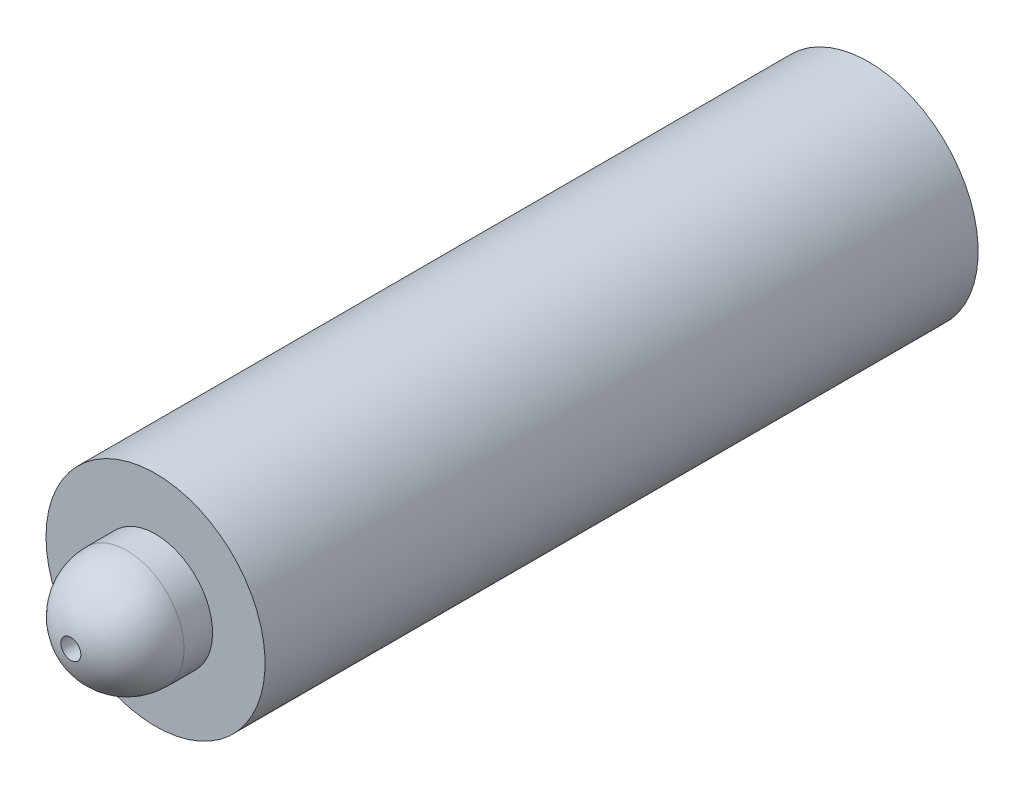
ISO-10303-21;
HEADER;
FILE_DESCRIPTION(('STEP AP214'),'2;1');
FILE_NAME('part.step','',(''),(''),'','','');
FILE_SCHEMA(('AUTOMOTIVE_DESIGN { 1 0 10303 214 1 1 1 1 }'));
ENDSEC;
DATA;
#1=APPLICATION_CONTEXT('core data for automotive mechanical design processes');
#2=APPLICATION_PROTOCOL_DEFINITION('international standard','automotive_design',2000,#1);
#3=PRODUCT_CONTEXT('',#1,'mechanical');
#4=PRODUCT('Part','Part','',(#3));
#5=PRODUCT_RELATED_PRODUCT_CATEGORY('part','',(#4));
#6=PRODUCT_DEFINITION_FORMATION('','',#4);
#7=PRODUCT_DEFINITION_CONTEXT('part definition',#1,'design');
#8=PRODUCT_DEFINITION('design','',#6,#7);
#9=PRODUCT_DEFINITION_SHAPE('','',#8);
#10=(LENGTH_UNIT() NAMED_UNIT(*) SI_UNIT(.MILLI.,.METRE.));
#11=(NAMED_UNIT(*) PLANE_ANGLE_UNIT() SI_UNIT($,.RADIAN.));
#12=(NAMED_UNIT(*) SI_UNIT($,.STERADIAN.) SOLID_ANGLE_UNIT());
#13=UNCERTAINTY_MEASURE_WITH_UNIT(LENGTH_MEASURE(1.E-05),#10,'distance_accuracy_value','');
#14=(GEOMETRIC_REPRESENTATION_CONTEXT(3) GLOBAL_UNCERTAINTY_ASSIGNED_CONTEXT((#13)) GLOBAL_UNIT_ASSIGNED_CONTEXT((#10,
#11,#12)) REPRESENTATION_CONTEXT('',''));
#15=CARTESIAN_POINT('',(0.,0.,0.));
#16=DIRECTION('',(0.,0.,1.));
#17=DIRECTION('',(1.,0.,0.));
#18=AXIS2_PLACEMENT_3D('',#15,#16,#17);
#19=CARTESIAN_POINT('',(0.,0.,79.375));
#20=DIRECTION('',(0.,0.,-1.));
#21=DIRECTION('',(-1.,0.,0.));
#22=AXIS2_PLACEMENT_3D('',#19,#20,#21);
#23=CYLINDRICAL_SURFACE('',#22,9.017);
#24=CARTESIAN_POINT('',(0.,0.,19.05));
#25=DIRECTION('',(0.,0.,-1.));
#26=DIRECTION('',(-1.,0.,0.));
#27=AXIS2_PLACEMENT_3D('',#24,#25,#26);
#28=CIRCLE('',#27,9.017);
#29=CARTESIAN_POINT('',(8.43952984472479,-3.17499999999994,19.05));
#30=VERTEX_POINT('',#29);
#31=CARTESIAN_POINT('',(8.43952984472475,3.17500000000005,19.05));
#32=VERTEX_POINT('',#31);
#33=EDGE_CURVE('E107',#30,#32,#28,.F.);
#34=ORIENTED_EDGE('',*,*,#33,.F.);
#35=DIRECTION('',(0.,0.,-1.));
#36=VECTOR('',#35,1.);
#37=CARTESIAN_POINT('',(8.43952984472479,-3.17499999999993,19.05));
#38=LINE('',#37,#36);
#39=CARTESIAN_POINT('',(8.43952984472479,-3.17499999999993,0.));
#40=VERTEX_POINT('',#39);
#41=EDGE_CURVE('E105',#30,#40,#38,.T.);
#42=ORIENTED_EDGE('',*,*,#41,.T.);
#43=CARTESIAN_POINT('',(0.,0.,0.));
#44=DIRECTION('',(0.,0.,1.));
#45=DIRECTION('',(1.,0.,0.));
#46=AXIS2_PLACEMENT_3D('',#43,#44,#45);
#47=CIRCLE('',#46,9.017);
#48=CARTESIAN_POINT('',(3.17500000000002,-8.43952984472476,0.));
#49=VERTEX_POINT('',#48);
#50=EDGE_CURVE('E118',#49,#40,#47,.T.);
#51=ORIENTED_EDGE('',*,*,#50,.F.);
#52=DIRECTION('',(0.,0.,-1.));
#53=VECTOR('',#52,1.);
#54=CARTESIAN_POINT('',(3.17500000000002,-8.43952984472476,19.05));
#55=LINE('',#54,#53);
#56=CARTESIAN_POINT('',(3.17500000000002,-8.43952984472476,19.05));
#57=VERTEX_POINT('',#56);
#58=EDGE_CURVE('E146',#57,#49,#55,.T.);
#59=ORIENTED_EDGE('',*,*,#58,.F.);
#60=CARTESIAN_POINT('',(0.,0.,19.05));
#61=DIRECTION('',(0.,0.,-1.));
#62=DIRECTION('',(-1.,0.,0.));
#63=AXIS2_PLACEMENT_3D('',#60,#61,#62);
#64=CIRCLE('',#63,9.017);
#65=CARTESIAN_POINT('',(-3.17499999999997,-8.43952984472478,19.05));
#66=VERTEX_POINT('',#65);
#67=EDGE_CURVE('E152',#66,#57,#64,.F.);
#68=ORIENTED_EDGE('',*,*,#67,.F.);
#69=DIRECTION('',(0.,0.,-1.));
#70=VECTOR('',#69,1.);
#71=CARTESIAN_POINT('',(-3.17499999999997,-8.43952984472478,19.05));
#72=LINE('',#71,#70);
#73=CARTESIAN_POINT('',(-3.17499999999997,-8.43952984472478,0.));
#74=VERTEX_POINT('',#73);
#75=EDGE_CURVE('E156',#66,#74,#72,.T.);
#76=ORIENTED_EDGE('',*,*,#75,.T.);
#77=CARTESIAN_POINT('',(-8.43952984472477,-3.17499999999999,0.));
#78=VERTEX_POINT('',#77);
#79=EDGE_CURVE('E121',#78,#74,#47,.T.);
#80=ORIENTED_EDGE('',*,*,#79,.F.);
#81=DIRECTION('',(0.,0.,-1.));
#82=VECTOR('',#81,1.);
#83=CARTESIAN_POINT('',(-8.43952984472477,-3.17499999999999,19.05));
#84=LINE('',#83,#82);
#85=CARTESIAN_POINT('',(-8.43952984472477,-3.17499999999999,19.05));
#86=VERTEX_POINT('',#85);
#87=EDGE_CURVE('E133',#86,#78,#84,.T.);
#88=ORIENTED_EDGE('',*,*,#87,.F.);
#89=CARTESIAN_POINT('',(0.,0.,19.05));
#90=DIRECTION('',(0.,0.,-1.));
#91=DIRECTION('',(-1.,0.,0.));
#92=AXIS2_PLACEMENT_3D('',#89,#90,#91);
#93=CIRCLE('',#92,9.017);
#94=CARTESIAN_POINT('',(-8.43952984472477,3.175,19.05));
#95=VERTEX_POINT('',#94);
#96=EDGE_CURVE('E139',#95,#86,#93,.F.);
#97=ORIENTED_EDGE('',*,*,#96,.F.);
#98=DIRECTION('',(0.,0.,-1.));
#99=VECTOR('',#98,1.);
#100=CARTESIAN_POINT('',(-8.43952984472477,3.17499999999999,19.05));
#101=LINE('',#100,#99);
#102=CARTESIAN_POINT('',(-8.43952984472477,3.17499999999999,0.));
#103=VERTEX_POINT('',#102);
#104=EDGE_CURVE('E143',#95,#103,#101,.T.);
#105=ORIENTED_EDGE('',*,*,#104,.T.);
#106=CARTESIAN_POINT('',(-3.17500000000008,8.43952984472473,0.));
#107=VERTEX_POINT('',#106);
#108=EDGE_CURVE('E162',#107,#103,#47,.T.);
#109=ORIENTED_EDGE('',*,*,#108,.F.);
#110=DIRECTION('',(0.,0.,-1.));
#111=VECTOR('',#110,1.);
#112=CARTESIAN_POINT('',(-3.17500000000008,8.43952984472473,19.05));
#113=LINE('',#112,#111);
#114=CARTESIAN_POINT('',(-3.17500000000008,8.43952984472473,19.05));
#115=VERTEX_POINT('',#114);
#116=EDGE_CURVE('E134',#115,#107,#113,.T.);
#117=ORIENTED_EDGE('',*,*,#116,.F.);
#118=CARTESIAN_POINT('',(0.,0.,19.05));
#119=DIRECTION('',(0.,0.,-1.));
#120=DIRECTION('',(-1.,0.,0.));
#121=AXIS2_PLACEMENT_3D('',#118,#119,#120);
#122=CIRCLE('',#121,9.017);
#123=CARTESIAN_POINT('',(3.17499999999991,8.4395298447248,19.05));
#124=VERTEX_POINT('',#123);
#125=EDGE_CURVE('E127',#124,#115,#122,.F.);
#126=ORIENTED_EDGE('',*,*,#125,.F.);
#127=DIRECTION('',(0.,0.,-1.));
#128=VECTOR('',#127,1.);
#129=CARTESIAN_POINT('',(3.1749999999999,8.4395298447248,19.05));
#130=LINE('',#129,#128);
#131=CARTESIAN_POINT('',(3.1749999999999,8.4395298447248,0.));
#132=VERTEX_POINT('',#131);
#133=EDGE_CURVE('E130',#124,#132,#130,.T.);
#134=ORIENTED_EDGE('',*,*,#133,.T.);
#135=CARTESIAN_POINT('',(8.43952984472475,3.17500000000005,0.));
#136=VERTEX_POINT('',#135);
#137=EDGE_CURVE('E117',#136,#132,#47,.T.);
#138=ORIENTED_EDGE('',*,*,#137,.F.);
#139=DIRECTION('',(0.,0.,-1.));
#140=VECTOR('',#139,1.);
#141=CARTESIAN_POINT('',(8.43952984472475,3.17500000000005,19.05));
#142=LINE('',#141,#140);
#143=EDGE_CURVE('E102',#32,#136,#142,.T.);
#144=ORIENTED_EDGE('',*,*,#143,.F.);
#145=EDGE_LOOP('',(#34,#42,#51,#59,#68,#76,#80,#88,#97,#105,#109,#117,#126,#134,#138,#144));
#146=FACE_BOUND('',#145,.T.);
#147=CARTESIAN_POINT('',(0.,0.,76.2));
#148=DIRECTION('',(0.,0.,1.));
#149=DIRECTION('',(1.,0.,0.));
#150=AXIS2_PLACEMENT_3D('',#147,#148,#149);
#151=CIRCLE('',#150,9.017);
#152=CARTESIAN_POINT('',(9.017,0.,76.2));
#153=VERTEX_POINT('',#152);
#154=EDGE_CURVE('E159',#153,#153,#151,.F.);
#155=ORIENTED_EDGE('',*,*,#154,.F.);
#156=EDGE_LOOP('',(#155));
#157=FACE_BOUND('',#156,.T.);
#158=ADVANCED_FACE('F35',(#146,#157),#23,.F.);
#159=CARTESIAN_POINT('',(0.,0.,0.));
#160=DIRECTION('',(0.,0.,1.));
#161=DIRECTION('',(1.,0.,0.));
#162=AXIS2_PLACEMENT_3D('',#159,#160,#161);
#163=PLANE('',#162);
#164=CARTESIAN_POINT('',(0.,0.,0.));
#165=DIRECTION('',(0.,0.,1.));
#166=DIRECTION('',(1.,0.,0.));
#167=AXIS2_PLACEMENT_3D('',#164,#165,#166);
#168=CIRCLE('',#167,12.192);
#169=CARTESIAN_POINT('',(-12.192,0.,0.));
#170=VERTEX_POINT('',#169);
#171=EDGE_CURVE('E44',#170,#170,#168,.T.);
#172=ORIENTED_EDGE('',*,*,#171,.F.);
#173=EDGE_LOOP('',(#172));
#174=FACE_BOUND('',#173,.T.);
#175=CARTESIAN_POINT('',(7.65040315173269,0.,0.));
#176=DIRECTION('',(0.,0.,-1.));
#177=DIRECTION('',(-1.,0.,0.));
#178=AXIS2_PLACEMENT_3D('',#175,#176,#177);
#179=CIRCLE('',#178,3.27159684826731);
#180=EDGE_CURVE('E108',#40,#136,#179,.F.);
#181=ORIENTED_EDGE('',*,*,#180,.T.);
#182=ORIENTED_EDGE('',*,*,#137,.T.);
#183=CARTESIAN_POINT('',(0.,7.65040315173269,0.));
#184=DIRECTION('',(0.,0.,-1.));
#185=DIRECTION('',(-1.,0.,0.));
#186=AXIS2_PLACEMENT_3D('',#183,#184,#185);
#187=CIRCLE('',#186,3.27159684826731);
#188=EDGE_CURVE('E128',#132,#107,#187,.F.);
#189=ORIENTED_EDGE('',*,*,#188,.T.);
#190=ORIENTED_EDGE('',*,*,#108,.T.);
#191=CARTESIAN_POINT('',(-7.65040315173269,0.,0.));
#192=DIRECTION('',(0.,0.,-1.));
#193=DIRECTION('',(-1.,0.,0.));
#194=AXIS2_PLACEMENT_3D('',#191,#192,#193);
#195=CIRCLE('',#194,3.27159684826731);
#196=EDGE_CURVE('E140',#103,#78,#195,.F.);
#197=ORIENTED_EDGE('',*,*,#196,.T.);
#198=ORIENTED_EDGE('',*,*,#79,.T.);
#199=CARTESIAN_POINT('',(0.,-7.65040315173269,0.));
#200=DIRECTION('',(0.,0.,-1.));
#201=DIRECTION('',(-1.,0.,0.));
#202=AXIS2_PLACEMENT_3D('',#199,#200,#201);
#203=CIRCLE('',#202,3.27159684826731);
#204=EDGE_CURVE('E153',#74,#49,#203,.F.);
#205=ORIENTED_EDGE('',*,*,#204,.T.);
#206=ORIENTED_EDGE('',*,*,#50,.T.);
#207=EDGE_LOOP('',(#181,#182,#189,#190,#197,#198,#205,#206));
#208=FACE_BOUND('',#207,.T.);
#209=ADVANCED_FACE('F167',(#174,#208),#163,.F.);
#210=CARTESIAN_POINT('',(0.,0.,79.375));
#211=DIRECTION('',(0.,0.,1.));
#212=DIRECTION('',(1.,0.,0.));
#213=AXIS2_PLACEMENT_3D('',#210,#211,#212);
#214=PLANE('',#213);
#215=CARTESIAN_POINT('',(0.,0.,79.375));
#216=DIRECTION('',(0.,0.,-1.));
#217=DIRECTION('',(0.,1.,0.));
#218=AXIS2_PLACEMENT_3D('',#215,#216,#217);
#219=CIRCLE('',#218,6.35);
#220=CARTESIAN_POINT('',(0.,6.35,79.375));
#221=VERTEX_POINT('',#220);
#222=EDGE_CURVE('E218',#221,#221,#219,.T.);
#223=ORIENTED_EDGE('',*,*,#222,.T.);
#224=EDGE_LOOP('',(#223));
#225=FACE_BOUND('',#224,.T.);
#226=CARTESIAN_POINT('',(0.,0.,79.375));
#227=DIRECTION('',(0.,0.,1.));
#228=DIRECTION('',(1.,0.,0.));
#229=AXIS2_PLACEMENT_3D('',#226,#227,#228);
#230=CIRCLE('',#229,12.192);
#231=CARTESIAN_POINT('',(-12.192,0.,79.375));
#232=VERTEX_POINT('',#231);
#233=EDGE_CURVE('E11',#232,#232,#230,.T.);
#234=ORIENTED_EDGE('',*,*,#233,.T.);
#235=EDGE_LOOP('',(#234));
#236=FACE_BOUND('',#235,.T.);
#237=ADVANCED_FACE('F170',(#225,#236),#214,.T.);
#238=CARTESIAN_POINT('',(0.,0.,79.375));
#239=DIRECTION('',(0.,0.,-1.));
#240=DIRECTION('',(-1.,0.,0.));
#241=AXIS2_PLACEMENT_3D('',#238,#239,#240);
#242=CYLINDRICAL_SURFACE('',#241,12.192);
#243=CARTESIAN_POINT('',(-12.192,0.,79.375));
#244=CARTESIAN_POINT('',(-12.192,0.,78.5481770833333));
#245=CARTESIAN_POINT('',(-12.192,0.,77.7213541666667));
#246=CARTESIAN_POINT('',(-12.192,0.,76.0677083333333));
#247=CARTESIAN_POINT('',(-12.192,0.,75.2408854166667));
#248=CARTESIAN_POINT('',(-12.192,0.,73.5872395833333));
#249=CARTESIAN_POINT('',(-12.192,0.,72.7604166666667));
#250=CARTESIAN_POINT('',(-12.192,0.,71.1067708333333));
#251=CARTESIAN_POINT('',(-12.192,0.,70.2799479166667));
#252=CARTESIAN_POINT('',(-12.192,0.,68.6263020833333));
#253=CARTESIAN_POINT('',(-12.192,0.,67.7994791666667));
#254=CARTESIAN_POINT('',(-12.192,0.,66.1458333333333));
#255=CARTESIAN_POINT('',(-12.192,0.,65.3190104166667));
#256=CARTESIAN_POINT('',(-12.192,0.,63.6653645833333));
#257=CARTESIAN_POINT('',(-12.192,0.,62.8385416666667));
#258=CARTESIAN_POINT('',(-12.192,0.,61.1848958333333));
#259=CARTESIAN_POINT('',(-12.192,0.,60.3580729166667));
#260=CARTESIAN_POINT('',(-12.192,0.,58.7044270833333));
#261=CARTESIAN_POINT('',(-12.192,0.,57.8776041666667));
#262=CARTESIAN_POINT('',(-12.192,0.,56.2239583333333));
#263=CARTESIAN_POINT('',(-12.192,0.,55.3971354166667));
#264=CARTESIAN_POINT('',(-12.192,0.,53.7434895833333));
#265=CARTESIAN_POINT('',(-12.192,0.,52.9166666666667));
#266=CARTESIAN_POINT('',(-12.192,0.,51.2630208333333));
#267=CARTESIAN_POINT('',(-12.192,0.,50.4361979166667));
#268=CARTESIAN_POINT('',(-12.192,0.,48.7825520833333));
#269=CARTESIAN_POINT('',(-12.192,0.,47.9557291666667));
#270=CARTESIAN_POINT('',(-12.192,0.,46.3020833333333));
#271=CARTESIAN_POINT('',(-12.192,0.,45.4752604166667));
#272=CARTESIAN_POINT('',(-12.192,0.,43.8216145833333));
#273=CARTESIAN_POINT('',(-12.192,0.,42.9947916666667));
#274=CARTESIAN_POINT('',(-12.192,0.,41.3411458333333));
#275=CARTESIAN_POINT('',(-12.192,0.,40.5143229166667));
#276=CARTESIAN_POINT('',(-12.192,0.,38.8606770833333));
#277=CARTESIAN_POINT('',(-12.192,0.,38.0338541666667));
#278=CARTESIAN_POINT('',(-12.192,0.,36.3802083333333));
#279=CARTESIAN_POINT('',(-12.192,0.,35.5533854166667));
#280=CARTESIAN_POINT('',(-12.192,0.,33.8997395833333));
#281=CARTESIAN_POINT('',(-12.192,0.,33.0729166666667));
#282=CARTESIAN_POINT('',(-12.192,0.,31.4192708333333));
#283=CARTESIAN_POINT('',(-12.192,0.,30.5924479166667));
#284=CARTESIAN_POINT('',(-12.192,0.,28.9388020833333));
#285=CARTESIAN_POINT('',(-12.192,0.,28.1119791666667));
#286=CARTESIAN_POINT('',(-12.192,0.,26.4583333333333));
#287=CARTESIAN_POINT('',(-12.192,0.,25.6315104166667));
#288=CARTESIAN_POINT('',(-12.192,0.,23.9778645833333));
#289=CARTESIAN_POINT('',(-12.192,0.,23.1510416666667));
#290=CARTESIAN_POINT('',(-12.192,0.,21.4973958333333));
#291=CARTESIAN_POINT('',(-12.192,0.,20.6705729166667));
#292=CARTESIAN_POINT('',(-12.192,0.,19.0169270833333));
#293=CARTESIAN_POINT('',(-12.192,0.,18.1901041666667));
#294=CARTESIAN_POINT('',(-12.192,0.,16.5364583333333));
#295=CARTESIAN_POINT('',(-12.192,0.,15.7096354166667));
#296=CARTESIAN_POINT('',(-12.192,0.,14.0559895833333));
#297=CARTESIAN_POINT('',(-12.192,0.,13.2291666666667));
#298=CARTESIAN_POINT('',(-12.192,0.,11.5755208333333));
#299=CARTESIAN_POINT('',(-12.192,0.,10.7486979166667));
#300=CARTESIAN_POINT('',(-12.192,0.,9.09505208333332));
#301=CARTESIAN_POINT('',(-12.192,0.,8.26822916666666));
#302=CARTESIAN_POINT('',(-12.192,0.,6.61458333333332));
#303=CARTESIAN_POINT('',(-12.192,0.,5.78776041666665));
#304=CARTESIAN_POINT('',(-12.192,0.,4.13411458333332));
#305=CARTESIAN_POINT('',(-12.192,0.,3.30729166666666));
#306=CARTESIAN_POINT('',(-12.192,0.,1.65364583333332));
#307=CARTESIAN_POINT('',(-12.192,0.,0.826822916666655));
#308=CARTESIAN_POINT('',(-12.192,0.,0.));
#309=B_SPLINE_CURVE_WITH_KNOTS('',3,(#243,#244,#245,#246,#247,#248,#249,#250,#251,#252,#253,
#254,#255,#256,#257,#258,#259,#260,#261,#262,#263,#264,#265,#266,#267,#268,#269,#270,#271,#272,
#273,#274,#275,#276,#277,#278,#279,#280,#281,#282,#283,#284,#285,#286,#287,#288,#289,#290,#291,
#292,#293,#294,#295,#296,#297,#298,#299,#300,#301,#302,#303,#304,#305,#306,#307,#308),
.UNSPECIFIED.,.F.,.F.,(4,2,2,2,2,2,2,2,2,2,2,2,2,2,2,2,2,2,2,2,2,2,2,2,2,2,2,2,2,2,2,2,4),(0.,
2.48046874999999,4.9609375,7.44140624999999,9.921875,12.40234375,14.8828125,17.36328125,
19.84375,22.32421875,24.8046875,27.28515625,29.765625,32.24609375,34.7265625,37.20703125,
39.6875,42.16796875,44.6484375,47.12890625,49.609375,52.08984375,54.5703125,57.05078125,
59.53125,62.01171875,64.4921875,66.97265625,69.453125,71.93359375,74.4140625,76.89453125,
79.375),.UNSPECIFIED.);
#310=EDGE_CURVE('BSEAM37',#232,#170,#309,.T.);
#311=ORIENTED_EDGE('',*,*,#233,.F.);
#312=ORIENTED_EDGE('',*,*,#171,.T.);
#313=ORIENTED_EDGE('',*,*,#310,.T.);
#314=ORIENTED_EDGE('',*,*,#310,.F.);
#315=EDGE_LOOP('',(#311,#313,#312,#314));
#316=FACE_BOUND('',#315,.T.);
#317=ADVANCED_FACE('F37',(#316),#242,.T.);
#318=CARTESIAN_POINT('',(0.,-7.65040315173269,19.05));
#319=DIRECTION('',(0.,0.,-1.));
#320=DIRECTION('',(-1.,0.,0.));
#321=AXIS2_PLACEMENT_3D('',#318,#319,#320);
#322=CYLINDRICAL_SURFACE('',#321,3.27159684826731);
#323=ORIENTED_EDGE('',*,*,#204,.F.);
#324=ORIENTED_EDGE('',*,*,#75,.F.);
#325=CARTESIAN_POINT('',(0.,-7.65040315173269,19.05));
#326=DIRECTION('',(0.,0.,-1.));
#327=DIRECTION('',(-1.,0.,0.));
#328=AXIS2_PLACEMENT_3D('',#325,#326,#327);
#329=CIRCLE('',#328,3.27159684826731);
#330=EDGE_CURVE('E150',#66,#57,#329,.F.);
#331=ORIENTED_EDGE('',*,*,#330,.T.);
#332=ORIENTED_EDGE('',*,*,#58,.T.);
#333=EDGE_LOOP('',(#323,#324,#331,#332));
#334=FACE_BOUND('',#333,.T.);
#335=ADVANCED_FACE('F175',(#334),#322,.F.);
#336=CARTESIAN_POINT('',(0.,0.,19.05));
#337=DIRECTION('',(0.,0.,-1.));
#338=DIRECTION('',(-1.,0.,0.));
#339=AXIS2_PLACEMENT_3D('',#336,#337,#338);
#340=PLANE('',#339);
#341=ORIENTED_EDGE('',*,*,#330,.F.);
#342=ORIENTED_EDGE('',*,*,#67,.T.);
#343=EDGE_LOOP('',(#341,#342));
#344=FACE_BOUND('',#343,.T.);
#345=ADVANCED_FACE('F200',(#344),#340,.T.);
#346=CARTESIAN_POINT('',(-7.65040315173269,0.,19.05));
#347=DIRECTION('',(0.,0.,-1.));
#348=DIRECTION('',(-1.,0.,0.));
#349=AXIS2_PLACEMENT_3D('',#346,#347,#348);
#350=CYLINDRICAL_SURFACE('',#349,3.27159684826731);
#351=ORIENTED_EDGE('',*,*,#196,.F.);
#352=ORIENTED_EDGE('',*,*,#104,.F.);
#353=CARTESIAN_POINT('',(-7.65040315173269,0.,19.05));
#354=DIRECTION('',(0.,0.,-1.));
#355=DIRECTION('',(-1.,0.,0.));
#356=AXIS2_PLACEMENT_3D('',#353,#354,#355);
#357=CIRCLE('',#356,3.27159684826731);
#358=EDGE_CURVE('E137',#95,#86,#357,.F.);
#359=ORIENTED_EDGE('',*,*,#358,.T.);
#360=ORIENTED_EDGE('',*,*,#87,.T.);
#361=EDGE_LOOP('',(#351,#352,#359,#360));
#362=FACE_BOUND('',#361,.T.);
#363=ADVANCED_FACE('F187',(#362),#350,.F.);
#364=CARTESIAN_POINT('',(0.,0.,19.05));
#365=DIRECTION('',(0.,0.,-1.));
#366=DIRECTION('',(-1.,0.,0.));
#367=AXIS2_PLACEMENT_3D('',#364,#365,#366);
#368=PLANE('',#367);
#369=ORIENTED_EDGE('',*,*,#358,.F.);
#370=ORIENTED_EDGE('',*,*,#96,.T.);
#371=EDGE_LOOP('',(#369,#370));
#372=FACE_BOUND('',#371,.T.);
#373=ADVANCED_FACE('F189',(#372),#368,.T.);
#374=CARTESIAN_POINT('',(0.,7.65040315173269,19.05));
#375=DIRECTION('',(0.,0.,-1.));
#376=DIRECTION('',(-1.,0.,0.));
#377=AXIS2_PLACEMENT_3D('',#374,#375,#376);
#378=CYLINDRICAL_SURFACE('',#377,3.27159684826731);
#379=ORIENTED_EDGE('',*,*,#188,.F.);
#380=ORIENTED_EDGE('',*,*,#133,.F.);
#381=CARTESIAN_POINT('',(0.,7.65040315173269,19.05));
#382=DIRECTION('',(0.,0.,-1.));
#383=DIRECTION('',(-1.,0.,0.));
#384=AXIS2_PLACEMENT_3D('',#381,#382,#383);
#385=CIRCLE('',#384,3.27159684826731);
#386=EDGE_CURVE('E58',#124,#115,#385,.F.);
#387=ORIENTED_EDGE('',*,*,#386,.T.);
#388=ORIENTED_EDGE('',*,*,#116,.T.);
#389=EDGE_LOOP('',(#379,#380,#387,#388));
#390=FACE_BOUND('',#389,.T.);
#391=ADVANCED_FACE('F191',(#390),#378,.F.);
#392=CARTESIAN_POINT('',(0.,0.,19.05));
#393=DIRECTION('',(0.,0.,-1.));
#394=DIRECTION('',(-1.,0.,0.));
#395=AXIS2_PLACEMENT_3D('',#392,#393,#394);
#396=PLANE('',#395);
#397=ORIENTED_EDGE('',*,*,#386,.F.);
#398=ORIENTED_EDGE('',*,*,#125,.T.);
#399=EDGE_LOOP('',(#397,#398));
#400=FACE_BOUND('',#399,.T.);
#401=ADVANCED_FACE('F197',(#400),#396,.T.);
#402=CARTESIAN_POINT('',(7.65040315173269,0.,19.05));
#403=DIRECTION('',(0.,0.,-1.));
#404=DIRECTION('',(-1.,0.,0.));
#405=AXIS2_PLACEMENT_3D('',#402,#403,#404);
#406=CYLINDRICAL_SURFACE('',#405,3.27159684826731);
#407=ORIENTED_EDGE('',*,*,#180,.F.);
#408=ORIENTED_EDGE('',*,*,#41,.F.);
#409=CARTESIAN_POINT('',(7.65040315173269,0.,19.05));
#410=DIRECTION('',(0.,0.,-1.));
#411=DIRECTION('',(-1.,0.,0.));
#412=AXIS2_PLACEMENT_3D('',#409,#410,#411);
#413=CIRCLE('',#412,3.27159684826731);
#414=EDGE_CURVE('E51',#30,#32,#413,.F.);
#415=ORIENTED_EDGE('',*,*,#414,.T.);
#416=ORIENTED_EDGE('',*,*,#143,.T.);
#417=EDGE_LOOP('',(#407,#408,#415,#416));
#418=FACE_BOUND('',#417,.T.);
#419=ADVANCED_FACE('F100',(#418),#406,.F.);
#420=CARTESIAN_POINT('',(0.,0.,19.05));
#421=DIRECTION('',(0.,0.,-1.));
#422=DIRECTION('',(-1.,0.,0.));
#423=AXIS2_PLACEMENT_3D('',#420,#421,#422);
#424=PLANE('',#423);
#425=ORIENTED_EDGE('',*,*,#414,.F.);
#426=ORIENTED_EDGE('',*,*,#33,.T.);
#427=EDGE_LOOP('',(#425,#426));
#428=FACE_BOUND('',#427,.T.);
#429=ADVANCED_FACE('F110',(#428),#424,.T.);
#430=CARTESIAN_POINT('',(0.,0.,76.2));
#431=DIRECTION('',(0.,0.,1.));
#432=DIRECTION('',(1.,0.,0.));
#433=AXIS2_PLACEMENT_3D('',#430,#431,#432);
#434=PLANE('',#433);
#435=CARTESIAN_POINT('',(0.,0.,76.2));
#436=DIRECTION('',(0.,0.,-1.));
#437=DIRECTION('',(-1.,0.,0.));
#438=AXIS2_PLACEMENT_3D('',#435,#436,#437);
#439=CIRCLE('',#438,1.11125);
#440=CARTESIAN_POINT('',(-1.11125,0.,76.2));
#441=VERTEX_POINT('',#440);
#442=EDGE_CURVE('E226',#441,#441,#439,.T.);
#443=ORIENTED_EDGE('',*,*,#442,.F.);
#444=EDGE_LOOP('',(#443));
#445=FACE_BOUND('',#444,.T.);
#446=ORIENTED_EDGE('',*,*,#154,.T.);
#447=EDGE_LOOP('',(#446));
#448=FACE_BOUND('',#447,.T.);
#449=ADVANCED_FACE('F232',(#445,#448),#434,.F.);
#450=CARTESIAN_POINT('',(0.,0.,79.375));
#451=DIRECTION('',(0.,0.,-1.));
#452=DIRECTION('',(0.,1.,0.));
#453=AXIS2_PLACEMENT_3D('',#450,#451,#452);
#454=CYLINDRICAL_SURFACE('',#453,6.35);
#455=CARTESIAN_POINT('',(0.,0.,82.55));
#456=DIRECTION('',(0.,0.,-1.));
#457=DIRECTION('',(0.,1.,0.));
#458=AXIS2_PLACEMENT_3D('',#455,#456,#457);
#459=CIRCLE('',#458,6.35);
#460=CARTESIAN_POINT('',(0.,6.35,82.55));
#461=VERTEX_POINT('',#460);
#462=EDGE_CURVE('E221',#461,#461,#459,.T.);
#463=ORIENTED_EDGE('',*,*,#462,.T.);
#464=EDGE_LOOP('',(#463));
#465=FACE_BOUND('',#464,.T.);
#466=ORIENTED_EDGE('',*,*,#222,.F.);
#467=EDGE_LOOP('',(#466));
#468=FACE_BOUND('',#467,.T.);
#469=ADVANCED_FACE('F234',(#465,#468),#454,.T.);
#470=CARTESIAN_POINT('',(0.,0.,82.55));
#471=DIRECTION('',(0.,0.,-1.));
#472=DIRECTION('',(0.,1.,0.));
#473=AXIS2_PLACEMENT_3D('',#470,#471,#472);
#474=SPHERICAL_SURFACE('',#473,6.35);
#475=CARTESIAN_POINT('',(0.,0.,88.8020095519361));
#476=DIRECTION('',(0.,0.,-1.));
#477=DIRECTION('',(-1.,0.,0.));
#478=AXIS2_PLACEMENT_3D('',#475,#476,#477);
#479=CIRCLE('',#478,1.11125);
#480=CARTESIAN_POINT('',(-1.11125,0.,88.8020095519361));
#481=VERTEX_POINT('',#480);
#482=EDGE_CURVE('E39',#481,#481,#479,.F.);
#483=ORIENTED_EDGE('',*,*,#482,.F.);
#484=EDGE_LOOP('',(#483));
#485=FACE_BOUND('',#484,.T.);
#486=ORIENTED_EDGE('',*,*,#462,.F.);
#487=EDGE_LOOP('',(#486));
#488=FACE_BOUND('',#487,.T.);
#489=ADVANCED_FACE('F241',(#485,#488),#474,.T.);
#490=CARTESIAN_POINT('',(0.,0.,88.9));
#491=DIRECTION('',(0.,0.,-1.));
#492=DIRECTION('',(-1.,0.,0.));
#493=AXIS2_PLACEMENT_3D('',#490,#491,#492);
#494=CYLINDRICAL_SURFACE('',#493,1.11125);
#495=ORIENTED_EDGE('',*,*,#482,.T.);
#496=EDGE_LOOP('',(#495));
#497=FACE_BOUND('',#496,.T.);
#498=ORIENTED_EDGE('',*,*,#442,.T.);
#499=EDGE_LOOP('',(#498));
#500=FACE_BOUND('',#499,.T.);
#501=ADVANCED_FACE('F291',(#497,#500),#494,.F.);
#502=CLOSED_SHELL('',(#158,#209,#237,#317,#335,#345,#363,#373,#391,#401,#419,#429,#449,#469,
#489,#501));
#503=MANIFOLD_SOLID_BREP('B2',#502);
#504=ADVANCED_BREP_SHAPE_REPRESENTATION('',(#18,#503),#14);
#505=SHAPE_DEFINITION_REPRESENTATION(#9,#504);
ENDSEC;
END-ISO-10303-21;
